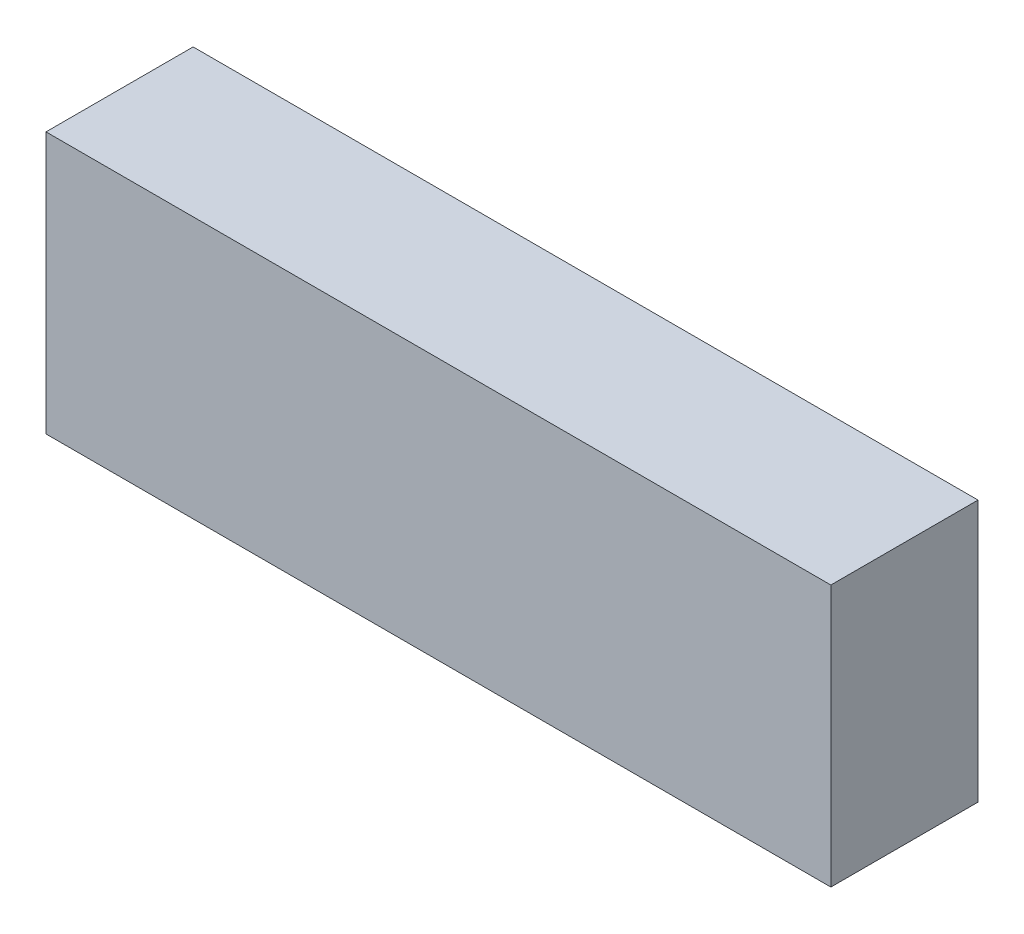
ISO-10303-21;
HEADER;
FILE_DESCRIPTION(('STEP AP214'),'2;1');
FILE_NAME('part.step','',(''),(''),'','','');
FILE_SCHEMA(('AUTOMOTIVE_DESIGN { 1 0 10303 214 1 1 1 1 }'));
ENDSEC;
DATA;
#1=APPLICATION_CONTEXT('core data for automotive mechanical design processes');
#2=APPLICATION_PROTOCOL_DEFINITION('international standard','automotive_design',2000,#1);
#3=PRODUCT_CONTEXT('',#1,'mechanical');
#4=PRODUCT('Part','Part','',(#3));
#5=PRODUCT_RELATED_PRODUCT_CATEGORY('part','',(#4));
#6=PRODUCT_DEFINITION_FORMATION('','',#4);
#7=PRODUCT_DEFINITION_CONTEXT('part definition',#1,'design');
#8=PRODUCT_DEFINITION('design','',#6,#7);
#9=PRODUCT_DEFINITION_SHAPE('','',#8);
#10=(LENGTH_UNIT() NAMED_UNIT(*) SI_UNIT(.MILLI.,.METRE.));
#11=(NAMED_UNIT(*) PLANE_ANGLE_UNIT() SI_UNIT($,.RADIAN.));
#12=(NAMED_UNIT(*) SI_UNIT($,.STERADIAN.) SOLID_ANGLE_UNIT());
#13=UNCERTAINTY_MEASURE_WITH_UNIT(LENGTH_MEASURE(1.E-05),#10,'distance_accuracy_value','');
#14=(GEOMETRIC_REPRESENTATION_CONTEXT(3) GLOBAL_UNCERTAINTY_ASSIGNED_CONTEXT((#13)) GLOBAL_UNIT_ASSIGNED_CONTEXT((#10,
#11,#12)) REPRESENTATION_CONTEXT('',''));
#15=CARTESIAN_POINT('',(0.,0.,0.));
#16=DIRECTION('',(0.,0.,1.));
#17=DIRECTION('',(1.,0.,0.));
#18=AXIS2_PLACEMENT_3D('',#15,#16,#17);
#19=CARTESIAN_POINT('',(-2.54,-0.889,1.));
#20=DIRECTION('',(1.,0.,0.));
#21=DIRECTION('',(0.,0.,-1.));
#22=AXIS2_PLACEMENT_3D('',#19,#20,#21);
#23=PLANE('',#22);
#24=DIRECTION('',(0.,-1.,0.));
#25=VECTOR('',#24,1.);
#26=CARTESIAN_POINT('',(-2.54,-0.889,0.));
#27=LINE('',#26,#25);
#28=CARTESIAN_POINT('',(-2.54,0.889,0.));
#29=VERTEX_POINT('',#28);
#30=CARTESIAN_POINT('',(-2.54,-0.889,0.));
#31=VERTEX_POINT('',#30);
#32=EDGE_CURVE('E95',#29,#31,#27,.T.);
#33=ORIENTED_EDGE('',*,*,#32,.T.);
#34=DIRECTION('',(0.,0.,-1.));
#35=VECTOR('',#34,1.);
#36=CARTESIAN_POINT('',(-2.54,-0.889,1.));
#37=LINE('',#36,#35);
#38=CARTESIAN_POINT('',(-2.54,-0.889,1.));
#39=VERTEX_POINT('',#38);
#40=EDGE_CURVE('E11',#39,#31,#37,.T.);
#41=ORIENTED_EDGE('',*,*,#40,.F.);
#42=DIRECTION('',(0.,-1.,0.));
#43=VECTOR('',#42,1.);
#44=CARTESIAN_POINT('',(-2.54,-0.889,1.));
#45=LINE('',#44,#43);
#46=CARTESIAN_POINT('',(-2.54,0.889,1.));
#47=VERTEX_POINT('',#46);
#48=EDGE_CURVE('E83',#47,#39,#45,.T.);
#49=ORIENTED_EDGE('',*,*,#48,.F.);
#50=DIRECTION('',(0.,0.,-1.));
#51=VECTOR('',#50,1.);
#52=CARTESIAN_POINT('',(-2.54,0.889,1.));
#53=LINE('',#52,#51);
#54=EDGE_CURVE('E91',#47,#29,#53,.T.);
#55=ORIENTED_EDGE('',*,*,#54,.T.);
#56=EDGE_LOOP('',(#33,#41,#49,#55));
#57=FACE_BOUND('',#56,.T.);
#58=ADVANCED_FACE('F32',(#57),#23,.F.);
#59=CARTESIAN_POINT('',(2.794,-0.889,1.));
#60=DIRECTION('',(0.,1.,0.));
#61=DIRECTION('',(0.,0.,1.));
#62=AXIS2_PLACEMENT_3D('',#59,#60,#61);
#63=PLANE('',#62);
#64=DIRECTION('',(1.,0.,0.));
#65=VECTOR('',#64,1.);
#66=CARTESIAN_POINT('',(2.794,-0.889,0.));
#67=LINE('',#66,#65);
#68=CARTESIAN_POINT('',(2.794,-0.889,0.));
#69=VERTEX_POINT('',#68);
#70=EDGE_CURVE('E87',#31,#69,#67,.T.);
#71=ORIENTED_EDGE('',*,*,#70,.T.);
#72=DIRECTION('',(0.,0.,-1.));
#73=VECTOR('',#72,1.);
#74=CARTESIAN_POINT('',(2.794,-0.889,1.));
#75=LINE('',#74,#73);
#76=CARTESIAN_POINT('',(2.794,-0.889,1.));
#77=VERTEX_POINT('',#76);
#78=EDGE_CURVE('E40',#77,#69,#75,.T.);
#79=ORIENTED_EDGE('',*,*,#78,.F.);
#80=DIRECTION('',(1.,0.,0.));
#81=VECTOR('',#80,1.);
#82=CARTESIAN_POINT('',(2.794,-0.889,1.));
#83=LINE('',#82,#81);
#84=EDGE_CURVE('E78',#39,#77,#83,.T.);
#85=ORIENTED_EDGE('',*,*,#84,.F.);
#86=ORIENTED_EDGE('',*,*,#40,.T.);
#87=EDGE_LOOP('',(#71,#79,#85,#86));
#88=FACE_BOUND('',#87,.T.);
#89=ADVANCED_FACE('F86',(#88),#63,.F.);
#90=CARTESIAN_POINT('',(2.794,0.889,1.));
#91=DIRECTION('',(-1.,0.,0.));
#92=DIRECTION('',(0.,0.,1.));
#93=AXIS2_PLACEMENT_3D('',#90,#91,#92);
#94=PLANE('',#93);
#95=DIRECTION('',(0.,1.,0.));
#96=VECTOR('',#95,1.);
#97=CARTESIAN_POINT('',(2.794,0.889,0.));
#98=LINE('',#97,#96);
#99=CARTESIAN_POINT('',(2.794,0.889,0.));
#100=VERTEX_POINT('',#99);
#101=EDGE_CURVE('E65',#69,#100,#98,.T.);
#102=ORIENTED_EDGE('',*,*,#101,.T.);
#103=DIRECTION('',(0.,0.,-1.));
#104=VECTOR('',#103,1.);
#105=CARTESIAN_POINT('',(2.794,0.889,1.));
#106=LINE('',#105,#104);
#107=CARTESIAN_POINT('',(2.794,0.889,1.));
#108=VERTEX_POINT('',#107);
#109=EDGE_CURVE('E88',#108,#100,#106,.T.);
#110=ORIENTED_EDGE('',*,*,#109,.F.);
#111=DIRECTION('',(0.,1.,0.));
#112=VECTOR('',#111,1.);
#113=CARTESIAN_POINT('',(2.794,0.889,1.));
#114=LINE('',#113,#112);
#115=EDGE_CURVE('E81',#77,#108,#114,.T.);
#116=ORIENTED_EDGE('',*,*,#115,.F.);
#117=ORIENTED_EDGE('',*,*,#78,.T.);
#118=EDGE_LOOP('',(#102,#110,#116,#117));
#119=FACE_BOUND('',#118,.T.);
#120=ADVANCED_FACE('F89',(#119),#94,.F.);
#121=CARTESIAN_POINT('',(-2.54,0.889,1.));
#122=DIRECTION('',(0.,-1.,0.));
#123=DIRECTION('',(0.,0.,-1.));
#124=AXIS2_PLACEMENT_3D('',#121,#122,#123);
#125=PLANE('',#124);
#126=DIRECTION('',(-1.,0.,0.));
#127=VECTOR('',#126,1.);
#128=CARTESIAN_POINT('',(-2.54,0.889,0.));
#129=LINE('',#128,#127);
#130=EDGE_CURVE('E71',#100,#29,#129,.T.);
#131=ORIENTED_EDGE('',*,*,#130,.T.);
#132=ORIENTED_EDGE('',*,*,#54,.F.);
#133=DIRECTION('',(-1.,0.,0.));
#134=VECTOR('',#133,1.);
#135=CARTESIAN_POINT('',(-2.54,0.889,1.));
#136=LINE('',#135,#134);
#137=EDGE_CURVE('E48',#108,#47,#136,.T.);
#138=ORIENTED_EDGE('',*,*,#137,.F.);
#139=ORIENTED_EDGE('',*,*,#109,.T.);
#140=EDGE_LOOP('',(#131,#132,#138,#139));
#141=FACE_BOUND('',#140,.T.);
#142=ADVANCED_FACE('F102',(#141),#125,.F.);
#143=CARTESIAN_POINT('',(0.,0.,1.));
#144=DIRECTION('',(0.,0.,-1.));
#145=DIRECTION('',(-1.,0.,0.));
#146=AXIS2_PLACEMENT_3D('',#143,#144,#145);
#147=PLANE('',#146);
#148=ORIENTED_EDGE('',*,*,#48,.T.);
#149=ORIENTED_EDGE('',*,*,#84,.T.);
#150=ORIENTED_EDGE('',*,*,#115,.T.);
#151=ORIENTED_EDGE('',*,*,#137,.T.);
#152=EDGE_LOOP('',(#148,#149,#150,#151));
#153=FACE_BOUND('',#152,.T.);
#154=ADVANCED_FACE('F79',(#153),#147,.F.);
#155=CARTESIAN_POINT('',(0.,0.,0.));
#156=DIRECTION('',(0.,0.,-1.));
#157=DIRECTION('',(-1.,0.,0.));
#158=AXIS2_PLACEMENT_3D('',#155,#156,#157);
#159=PLANE('',#158);
#160=ORIENTED_EDGE('',*,*,#32,.F.);
#161=ORIENTED_EDGE('',*,*,#130,.F.);
#162=ORIENTED_EDGE('',*,*,#101,.F.);
#163=ORIENTED_EDGE('',*,*,#70,.F.);
#164=EDGE_LOOP('',(#160,#161,#162,#163));
#165=FACE_BOUND('',#164,.T.);
#166=ADVANCED_FACE('F105',(#165),#159,.T.);
#167=CLOSED_SHELL('',(#58,#89,#120,#142,#154,#166));
#168=MANIFOLD_SOLID_BREP('B2',#167);
#169=ADVANCED_BREP_SHAPE_REPRESENTATION('',(#18,#168),#14);
#170=SHAPE_DEFINITION_REPRESENTATION(#9,#169);
ENDSEC;
END-ISO-10303-21;
